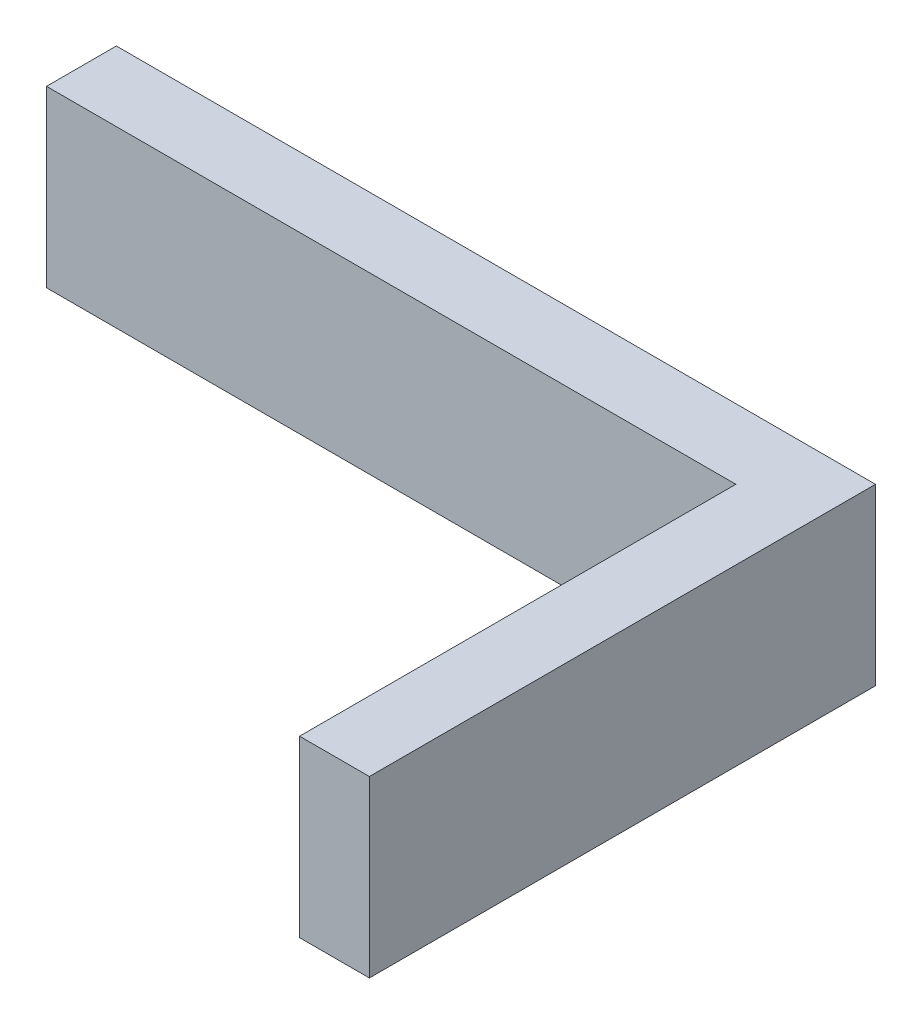
ISO-10303-21;
HEADER;
FILE_DESCRIPTION(('STEP AP214'),'2;1');
FILE_NAME('part.step','',(''),(''),'','','');
FILE_SCHEMA(('AUTOMOTIVE_DESIGN { 1 0 10303 214 1 1 1 1 }'));
ENDSEC;
DATA;
#1=APPLICATION_CONTEXT('core data for automotive mechanical design processes');
#2=APPLICATION_PROTOCOL_DEFINITION('international standard','automotive_design',2000,#1);
#3=PRODUCT_CONTEXT('',#1,'mechanical');
#4=PRODUCT('Part','Part','',(#3));
#5=PRODUCT_RELATED_PRODUCT_CATEGORY('part','',(#4));
#6=PRODUCT_DEFINITION_FORMATION('','',#4);
#7=PRODUCT_DEFINITION_CONTEXT('part definition',#1,'design');
#8=PRODUCT_DEFINITION('design','',#6,#7);
#9=PRODUCT_DEFINITION_SHAPE('','',#8);
#10=(LENGTH_UNIT() NAMED_UNIT(*) SI_UNIT(.MILLI.,.METRE.));
#11=(NAMED_UNIT(*) PLANE_ANGLE_UNIT() SI_UNIT($,.RADIAN.));
#12=(NAMED_UNIT(*) SI_UNIT($,.STERADIAN.) SOLID_ANGLE_UNIT());
#13=UNCERTAINTY_MEASURE_WITH_UNIT(LENGTH_MEASURE(1.E-05),#10,'distance_accuracy_value','');
#14=(GEOMETRIC_REPRESENTATION_CONTEXT(3) GLOBAL_UNCERTAINTY_ASSIGNED_CONTEXT((#13)) GLOBAL_UNIT_ASSIGNED_CONTEXT((#10,
#11,#12)) REPRESENTATION_CONTEXT('',''));
#15=CARTESIAN_POINT('',(0.,0.,0.));
#16=DIRECTION('',(0.,0.,1.));
#17=DIRECTION('',(1.,0.,0.));
#18=AXIS2_PLACEMENT_3D('',#15,#16,#17);
#19=CARTESIAN_POINT('',(0.,0.,4.));
#20=DIRECTION('',(0.,0.,-1.));
#21=DIRECTION('',(-1.,0.,0.));
#22=AXIS2_PLACEMENT_3D('',#19,#20,#21);
#23=PLANE('',#22);
#24=DIRECTION('',(0.,-1.,0.));
#25=VECTOR('',#24,1.);
#26=CARTESIAN_POINT('',(39.5,10.,4.));
#27=LINE('',#26,#25);
#28=CARTESIAN_POINT('',(39.5,10.,4.));
#29=VERTEX_POINT('',#28);
#30=CARTESIAN_POINT('',(39.5,0.,4.));
#31=VERTEX_POINT('',#30);
#32=EDGE_CURVE('E48',#29,#31,#27,.T.);
#33=ORIENTED_EDGE('',*,*,#32,.F.);
#34=DIRECTION('',(-1.,0.,0.));
#35=VECTOR('',#34,1.);
#36=CARTESIAN_POINT('',(0.,10.,4.));
#37=LINE('',#36,#35);
#38=CARTESIAN_POINT('',(0.,10.,4.));
#39=VERTEX_POINT('',#38);
#40=EDGE_CURVE('E53',#29,#39,#37,.T.);
#41=ORIENTED_EDGE('',*,*,#40,.T.);
#42=DIRECTION('',(0.,-1.,0.));
#43=VECTOR('',#42,1.);
#44=CARTESIAN_POINT('',(0.,0.,4.));
#45=LINE('',#44,#43);
#46=CARTESIAN_POINT('',(0.,0.,4.));
#47=VERTEX_POINT('',#46);
#48=EDGE_CURVE('E84',#39,#47,#45,.T.);
#49=ORIENTED_EDGE('',*,*,#48,.T.);
#50=DIRECTION('',(1.,0.,0.));
#51=VECTOR('',#50,1.);
#52=CARTESIAN_POINT('',(0.,0.,4.));
#53=LINE('',#52,#51);
#54=EDGE_CURVE('E134',#47,#31,#53,.T.);
#55=ORIENTED_EDGE('',*,*,#54,.T.);
#56=EDGE_LOOP('',(#33,#41,#49,#55));
#57=FACE_BOUND('',#56,.T.);
#58=ADVANCED_FACE('F33',(#57),#23,.F.);
#59=CARTESIAN_POINT('',(0.,0.,4.));
#60=DIRECTION('',(1.,0.,0.));
#61=DIRECTION('',(0.,0.,-1.));
#62=AXIS2_PLACEMENT_3D('',#59,#60,#61);
#63=PLANE('',#62);
#64=DIRECTION('',(0.,-1.,0.));
#65=VECTOR('',#64,1.);
#66=CARTESIAN_POINT('',(0.,0.,0.));
#67=LINE('',#66,#65);
#68=CARTESIAN_POINT('',(0.,10.,0.));
#69=VERTEX_POINT('',#68);
#70=CARTESIAN_POINT('',(0.,0.,0.));
#71=VERTEX_POINT('',#70);
#72=EDGE_CURVE('E90',#69,#71,#67,.T.);
#73=ORIENTED_EDGE('',*,*,#72,.T.);
#74=DIRECTION('',(0.,0.,-1.));
#75=VECTOR('',#74,1.);
#76=CARTESIAN_POINT('',(0.,0.,4.));
#77=LINE('',#76,#75);
#78=EDGE_CURVE('E11',#47,#71,#77,.T.);
#79=ORIENTED_EDGE('',*,*,#78,.F.);
#80=ORIENTED_EDGE('',*,*,#48,.F.);
#81=DIRECTION('',(0.,0.,-1.));
#82=VECTOR('',#81,1.);
#83=CARTESIAN_POINT('',(0.,10.,4.));
#84=LINE('',#83,#82);
#85=EDGE_CURVE('E76',#39,#69,#84,.T.);
#86=ORIENTED_EDGE('',*,*,#85,.T.);
#87=EDGE_LOOP('',(#73,#79,#80,#86));
#88=FACE_BOUND('',#87,.T.);
#89=ADVANCED_FACE('F35',(#88),#63,.F.);
#90=CARTESIAN_POINT('',(0.,0.,4.));
#91=DIRECTION('',(0.,1.,0.));
#92=DIRECTION('',(0.,0.,1.));
#93=AXIS2_PLACEMENT_3D('',#90,#91,#92);
#94=PLANE('',#93);
#95=DIRECTION('',(1.,0.,0.));
#96=VECTOR('',#95,1.);
#97=CARTESIAN_POINT('',(0.,0.,0.));
#98=LINE('',#97,#96);
#99=CARTESIAN_POINT('',(43.5,0.,0.));
#100=VERTEX_POINT('',#99);
#101=EDGE_CURVE('E93',#71,#100,#98,.T.);
#102=ORIENTED_EDGE('',*,*,#101,.T.);
#103=DIRECTION('',(0.,0.,-1.));
#104=VECTOR('',#103,1.);
#105=CARTESIAN_POINT('',(43.5,0.,4.));
#106=LINE('',#105,#104);
#107=CARTESIAN_POINT('',(43.5,0.,29.));
#108=VERTEX_POINT('',#107);
#109=EDGE_CURVE('E41',#108,#100,#106,.T.);
#110=ORIENTED_EDGE('',*,*,#109,.F.);
#111=DIRECTION('',(1.,0.,0.));
#112=VECTOR('',#111,1.);
#113=CARTESIAN_POINT('',(43.5,0.,29.));
#114=LINE('',#113,#112);
#115=CARTESIAN_POINT('',(39.5,0.,29.));
#116=VERTEX_POINT('',#115);
#117=EDGE_CURVE('E117',#116,#108,#114,.T.);
#118=ORIENTED_EDGE('',*,*,#117,.F.);
#119=DIRECTION('',(0.,0.,-1.));
#120=VECTOR('',#119,1.);
#121=CARTESIAN_POINT('',(39.5,0.,29.));
#122=LINE('',#121,#120);
#123=EDGE_CURVE('E98',#116,#31,#122,.T.);
#124=ORIENTED_EDGE('',*,*,#123,.T.);
#125=ORIENTED_EDGE('',*,*,#54,.F.);
#126=ORIENTED_EDGE('',*,*,#78,.T.);
#127=EDGE_LOOP('',(#102,#110,#118,#124,#125,#126));
#128=FACE_BOUND('',#127,.T.);
#129=ADVANCED_FACE('F114',(#128),#94,.F.);
#130=CARTESIAN_POINT('',(43.5,0.,4.));
#131=DIRECTION('',(-1.,0.,0.));
#132=DIRECTION('',(0.,0.,1.));
#133=AXIS2_PLACEMENT_3D('',#130,#131,#132);
#134=PLANE('',#133);
#135=DIRECTION('',(0.,1.,0.));
#136=VECTOR('',#135,1.);
#137=CARTESIAN_POINT('',(43.5,0.,0.));
#138=LINE('',#137,#136);
#139=CARTESIAN_POINT('',(43.5,10.,0.));
#140=VERTEX_POINT('',#139);
#141=EDGE_CURVE('E85',#100,#140,#138,.T.);
#142=ORIENTED_EDGE('',*,*,#141,.T.);
#143=DIRECTION('',(0.,0.,-1.));
#144=VECTOR('',#143,1.);
#145=CARTESIAN_POINT('',(43.5,10.,4.));
#146=LINE('',#145,#144);
#147=CARTESIAN_POINT('',(43.5,10.,29.));
#148=VERTEX_POINT('',#147);
#149=EDGE_CURVE('E80',#148,#140,#146,.T.);
#150=ORIENTED_EDGE('',*,*,#149,.F.);
#151=DIRECTION('',(0.,1.,0.));
#152=VECTOR('',#151,1.);
#153=CARTESIAN_POINT('',(43.5,10.,29.));
#154=LINE('',#153,#152);
#155=EDGE_CURVE('E110',#108,#148,#154,.T.);
#156=ORIENTED_EDGE('',*,*,#155,.F.);
#157=ORIENTED_EDGE('',*,*,#109,.T.);
#158=EDGE_LOOP('',(#142,#150,#156,#157));
#159=FACE_BOUND('',#158,.T.);
#160=ADVANCED_FACE('F108',(#159),#134,.F.);
#161=CARTESIAN_POINT('',(0.,10.,4.));
#162=DIRECTION('',(0.,-1.,0.));
#163=DIRECTION('',(0.,0.,-1.));
#164=AXIS2_PLACEMENT_3D('',#161,#162,#163);
#165=PLANE('',#164);
#166=DIRECTION('',(-1.,0.,0.));
#167=VECTOR('',#166,1.);
#168=CARTESIAN_POINT('',(0.,10.,0.));
#169=LINE('',#168,#167);
#170=EDGE_CURVE('E73',#140,#69,#169,.T.);
#171=ORIENTED_EDGE('',*,*,#170,.T.);
#172=ORIENTED_EDGE('',*,*,#85,.F.);
#173=ORIENTED_EDGE('',*,*,#40,.F.);
#174=DIRECTION('',(0.,0.,-1.));
#175=VECTOR('',#174,1.);
#176=CARTESIAN_POINT('',(39.5,10.,29.));
#177=LINE('',#176,#175);
#178=CARTESIAN_POINT('',(39.5,10.,29.));
#179=VERTEX_POINT('',#178);
#180=EDGE_CURVE('E94',#179,#29,#177,.T.);
#181=ORIENTED_EDGE('',*,*,#180,.F.);
#182=DIRECTION('',(-1.,0.,0.));
#183=VECTOR('',#182,1.);
#184=CARTESIAN_POINT('',(43.5,10.,29.));
#185=LINE('',#184,#183);
#186=EDGE_CURVE('E129',#148,#179,#185,.T.);
#187=ORIENTED_EDGE('',*,*,#186,.F.);
#188=ORIENTED_EDGE('',*,*,#149,.T.);
#189=EDGE_LOOP('',(#171,#172,#173,#181,#187,#188));
#190=FACE_BOUND('',#189,.T.);
#191=ADVANCED_FACE('F75',(#190),#165,.F.);
#192=CARTESIAN_POINT('',(0.,0.,0.));
#193=DIRECTION('',(0.,0.,-1.));
#194=DIRECTION('',(-1.,0.,0.));
#195=AXIS2_PLACEMENT_3D('',#192,#193,#194);
#196=PLANE('',#195);
#197=ORIENTED_EDGE('',*,*,#72,.F.);
#198=ORIENTED_EDGE('',*,*,#170,.F.);
#199=ORIENTED_EDGE('',*,*,#141,.F.);
#200=ORIENTED_EDGE('',*,*,#101,.F.);
#201=EDGE_LOOP('',(#197,#198,#199,#200));
#202=FACE_BOUND('',#201,.T.);
#203=ADVANCED_FACE('F92',(#202),#196,.T.);
#204=CARTESIAN_POINT('',(39.5,10.,29.));
#205=DIRECTION('',(1.,0.,0.));
#206=DIRECTION('',(0.,0.,-1.));
#207=AXIS2_PLACEMENT_3D('',#204,#205,#206);
#208=PLANE('',#207);
#209=ORIENTED_EDGE('',*,*,#32,.T.);
#210=ORIENTED_EDGE('',*,*,#123,.F.);
#211=DIRECTION('',(0.,-1.,0.));
#212=VECTOR('',#211,1.);
#213=CARTESIAN_POINT('',(39.5,10.,29.));
#214=LINE('',#213,#212);
#215=EDGE_CURVE('E125',#179,#116,#214,.T.);
#216=ORIENTED_EDGE('',*,*,#215,.F.);
#217=ORIENTED_EDGE('',*,*,#180,.T.);
#218=EDGE_LOOP('',(#209,#210,#216,#217));
#219=FACE_BOUND('',#218,.T.);
#220=ADVANCED_FACE('F137',(#219),#208,.F.);
#221=CARTESIAN_POINT('',(0.,0.,29.));
#222=DIRECTION('',(0.,0.,-1.));
#223=DIRECTION('',(-1.,0.,0.));
#224=AXIS2_PLACEMENT_3D('',#221,#222,#223);
#225=PLANE('',#224);
#226=ORIENTED_EDGE('',*,*,#155,.T.);
#227=ORIENTED_EDGE('',*,*,#186,.T.);
#228=ORIENTED_EDGE('',*,*,#215,.T.);
#229=ORIENTED_EDGE('',*,*,#117,.T.);
#230=EDGE_LOOP('',(#226,#227,#228,#229));
#231=FACE_BOUND('',#230,.T.);
#232=ADVANCED_FACE('F121',(#231),#225,.F.);
#233=CLOSED_SHELL('',(#58,#89,#129,#160,#191,#203,#220,#232));
#234=MANIFOLD_SOLID_BREP('B2',#233);
#235=ADVANCED_BREP_SHAPE_REPRESENTATION('',(#18,#234),#14);
#236=SHAPE_DEFINITION_REPRESENTATION(#9,#235);
ENDSEC;
END-ISO-10303-21;
